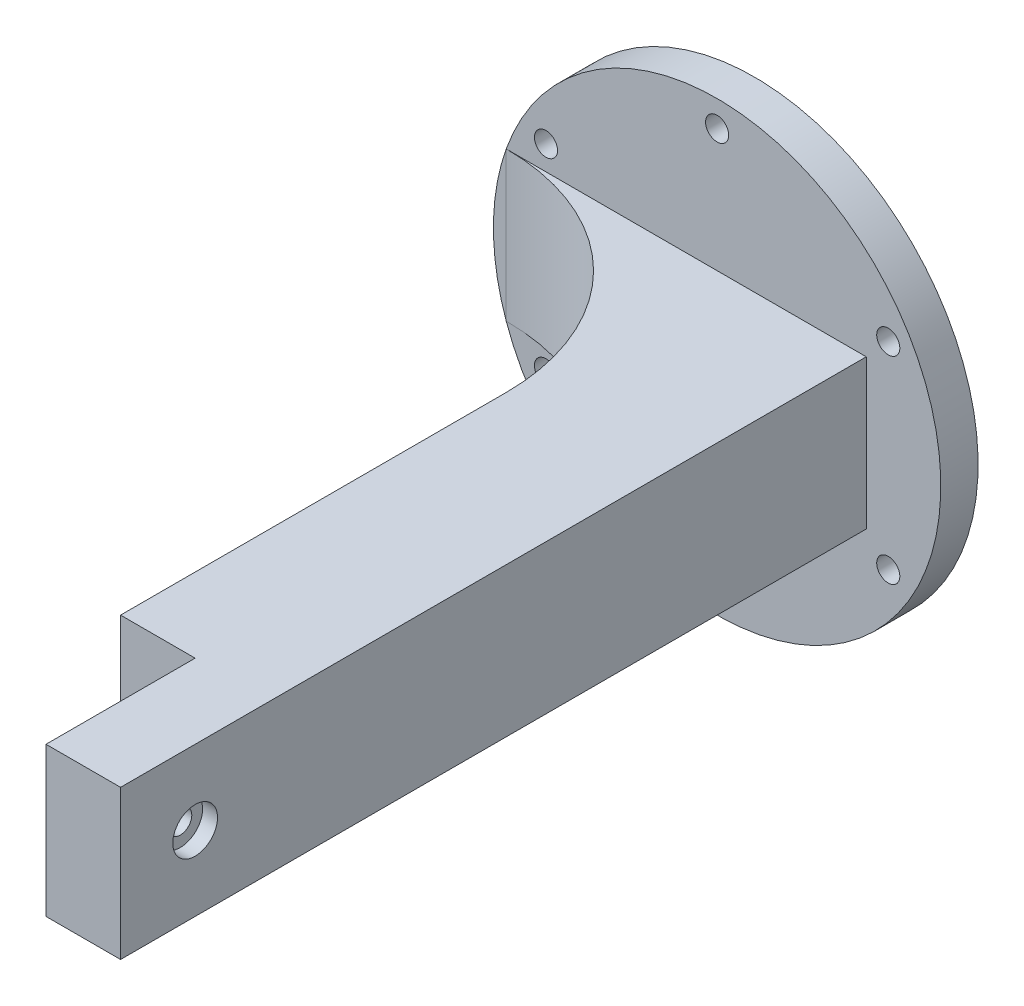
ISO-10303-21;
HEADER;
FILE_DESCRIPTION(('STEP AP214'),'2;1');
FILE_NAME('part.step','',(''),(''),'','','');
FILE_SCHEMA(('AUTOMOTIVE_DESIGN { 1 0 10303 214 1 1 1 1 }'));
ENDSEC;
DATA;
#1=APPLICATION_CONTEXT('core data for automotive mechanical design processes');
#2=APPLICATION_PROTOCOL_DEFINITION('international standard','automotive_design',2000,#1);
#3=PRODUCT_CONTEXT('',#1,'mechanical');
#4=PRODUCT('Part','Part','',(#3));
#5=PRODUCT_RELATED_PRODUCT_CATEGORY('part','',(#4));
#6=PRODUCT_DEFINITION_FORMATION('','',#4);
#7=PRODUCT_DEFINITION_CONTEXT('part definition',#1,'design');
#8=PRODUCT_DEFINITION('design','',#6,#7);
#9=PRODUCT_DEFINITION_SHAPE('','',#8);
#10=(LENGTH_UNIT() NAMED_UNIT(*) SI_UNIT(.MILLI.,.METRE.));
#11=(NAMED_UNIT(*) PLANE_ANGLE_UNIT() SI_UNIT($,.RADIAN.));
#12=(NAMED_UNIT(*) SI_UNIT($,.STERADIAN.) SOLID_ANGLE_UNIT());
#13=UNCERTAINTY_MEASURE_WITH_UNIT(LENGTH_MEASURE(1.E-05),#10,'distance_accuracy_value','');
#14=(GEOMETRIC_REPRESENTATION_CONTEXT(3) GLOBAL_UNCERTAINTY_ASSIGNED_CONTEXT((#13)) GLOBAL_UNIT_ASSIGNED_CONTEXT((#10,
#11,#12)) REPRESENTATION_CONTEXT('',''));
#15=CARTESIAN_POINT('',(0.,0.,0.));
#16=DIRECTION('',(0.,0.,1.));
#17=DIRECTION('',(1.,0.,0.));
#18=AXIS2_PLACEMENT_3D('',#15,#16,#17);
#19=CARTESIAN_POINT('',(-11.3775467694875,-10.8201831686628,-20.));
#20=DIRECTION('',(0.,0.,1.));
#21=DIRECTION('',(1.,0.,0.));
#22=AXIS2_PLACEMENT_3D('',#19,#20,#21);
#23=CYLINDRICAL_SURFACE('',#22,2.);
#24=CARTESIAN_POINT('',(-11.3775467694875,-10.8201831686628,80.));
#25=DIRECTION('',(0.,0.,1.));
#26=DIRECTION('',(1.,0.,0.));
#27=AXIS2_PLACEMENT_3D('',#24,#25,#26);
#28=CIRCLE('',#27,2.);
#29=CARTESIAN_POINT('',(-9.37754676948747,-10.8201831686628,80.));
#30=VERTEX_POINT('',#29);
#31=EDGE_CURVE('E390',#30,#30,#28,.T.);
#32=ORIENTED_EDGE('',*,*,#31,.T.);
#33=EDGE_LOOP('',(#32));
#34=FACE_BOUND('',#33,.T.);
#35=CARTESIAN_POINT('',(-11.3775467694875,-10.8201831686628,30.));
#36=DIRECTION('',(0.,0.,-1.));
#37=DIRECTION('',(-1.,0.,0.));
#38=AXIS2_PLACEMENT_3D('',#35,#36,#37);
#39=CIRCLE('',#38,2.);
#40=CARTESIAN_POINT('',(-10.0628026134659,-12.3273154801097,30.));
#41=VERTEX_POINT('',#40);
#42=CARTESIAN_POINT('',(-12.8846790809343,-9.50543901264125,30.));
#43=VERTEX_POINT('',#42);
#44=EDGE_CURVE('E296',#41,#43,#39,.T.);
#45=ORIENTED_EDGE('',*,*,#44,.T.);
#46=CARTESIAN_POINT('',(-11.3775467694875,-10.8201831686628,30.));
#47=DIRECTION('',(0.,0.,-1.));
#48=DIRECTION('',(-1.,0.,0.));
#49=AXIS2_PLACEMENT_3D('',#46,#47,#48);
#50=CIRCLE('',#49,2.);
#51=EDGE_CURVE('E12',#41,#43,#50,.F.);
#52=ORIENTED_EDGE('',*,*,#51,.F.);
#53=EDGE_LOOP('',(#45,#52));
#54=FACE_BOUND('',#53,.T.);
#55=ADVANCED_FACE('F156',(#34,#54),#23,.F.);
#56=CARTESIAN_POINT('',(0.,0.,-2.));
#57=DIRECTION('',(0.,0.,-1.));
#58=DIRECTION('',(-1.,0.,0.));
#59=AXIS2_PLACEMENT_3D('',#56,#57,#58);
#60=PLANE('',#59);
#61=DIRECTION('',(-1.,0.,0.));
#62=VECTOR('',#61,1.);
#63=CARTESIAN_POINT('',(-16.3775467694875,-4.82018316866282,-2.));
#64=LINE('',#63,#62);
#65=CARTESIAN_POINT('',(-16.3775467694875,-4.82018316866282,-2.));
#66=VERTEX_POINT('',#65);
#67=CARTESIAN_POINT('',(-46.310805863679,-4.82018316866282,-2.));
#68=VERTEX_POINT('',#67);
#69=EDGE_CURVE('E369',#66,#68,#64,.T.);
#70=ORIENTED_EDGE('',*,*,#69,.F.);
#71=DIRECTION('',(0.989696894724554,-0.14317840819263,0.));
#72=VECTOR('',#71,1.);
#73=CARTESIAN_POINT('',(-1.01877614010779,-7.04212035188726,-2.));
#74=LINE('',#73,#72);
#75=CARTESIAN_POINT('',(-9.60060106023687,-5.80059677229282,-2.));
#76=VERTEX_POINT('',#75);
#77=EDGE_CURVE('E172',#66,#76,#74,.T.);
#78=ORIENTED_EDGE('',*,*,#77,.T.);
#79=DIRECTION('',(-0.707106781186548,-0.707106781186547,0.));
#80=VECTOR('',#79,1.);
#81=CARTESIAN_POINT('',(-1.90000214397203,1.90000214397203,-2.));
#82=LINE('',#81,#80);
#83=CARTESIAN_POINT('',(-13.0950611907598,-9.29505690281575,-2.));
#84=VERTEX_POINT('',#83);
#85=EDGE_CURVE('E307',#76,#84,#82,.T.);
#86=ORIENTED_EDGE('',*,*,#85,.T.);
#87=DIRECTION('',(0.989696894724554,-0.143178408192631,0.));
#88=VECTOR('',#87,1.);
#89=CARTESIAN_POINT('',(-1.58558904402719,-10.9601201255969,-2.));
#90=LINE('',#89,#88);
#91=CARTESIAN_POINT('',(-16.3775467694875,-8.82018316866282,-2.));
#92=VERTEX_POINT('',#91);
#93=EDGE_CURVE('E311',#92,#84,#90,.T.);
#94=ORIENTED_EDGE('',*,*,#93,.F.);
#95=DIRECTION('',(1.,0.,0.));
#96=VECTOR('',#95,1.);
#97=CARTESIAN_POINT('',(-50.6830779439235,-8.82018316866282,-2.));
#98=LINE('',#97,#96);
#99=CARTESIAN_POINT('',(-46.310805863679,-8.82018316866282,-2.));
#100=VERTEX_POINT('',#99);
#101=EDGE_CURVE('E365',#100,#92,#98,.T.);
#102=ORIENTED_EDGE('',*,*,#101,.F.);
#103=CARTESIAN_POINT('',(-16.3775467694875,-6.82018316866282,-2.));
#104=DIRECTION('',(0.,0.,-1.));
#105=DIRECTION('',(-1.,0.,0.));
#106=AXIS2_PLACEMENT_3D('',#103,#104,#105);
#107=CIRCLE('',#106,30.);
#108=EDGE_CURVE('E387',#100,#68,#107,.T.);
#109=ORIENTED_EDGE('',*,*,#108,.T.);
#110=EDGE_LOOP('',(#70,#78,#86,#94,#102,#109));
#111=FACE_BOUND('',#110,.T.);
#112=ADVANCED_FACE('F551',(#111),#60,.T.);
#113=CARTESIAN_POINT('',(-16.3775467694875,-6.82018316866282,-5.));
#114=DIRECTION('',(0.,0.,-1.));
#115=DIRECTION('',(-1.,0.,0.));
#116=AXIS2_PLACEMENT_3D('',#113,#114,#115);
#117=PLANE('',#116);
#118=DIRECTION('',(0.989696894724554,-0.14317840819263,0.));
#119=VECTOR('',#118,1.);
#120=CARTESIAN_POINT('',(-1.01877614010779,-7.04212035188726,-5.));
#121=LINE('',#120,#119);
#122=CARTESIAN_POINT('',(-16.3775467694875,-4.82018316866282,-5.));
#123=VERTEX_POINT('',#122);
#124=CARTESIAN_POINT('',(-9.60060106023687,-5.80059677229282,-5.));
#125=VERTEX_POINT('',#124);
#126=EDGE_CURVE('E299',#123,#125,#121,.T.);
#127=ORIENTED_EDGE('',*,*,#126,.F.);
#128=DIRECTION('',(-1.,0.,0.));
#129=VECTOR('',#128,1.);
#130=CARTESIAN_POINT('',(-16.3775467694875,-4.82018316866282,-5.));
#131=LINE('',#130,#129);
#132=CARTESIAN_POINT('',(-46.310805863679,-4.82018316866282,-5.));
#133=VERTEX_POINT('',#132);
#134=EDGE_CURVE('E370',#123,#133,#131,.T.);
#135=ORIENTED_EDGE('',*,*,#134,.T.);
#136=CARTESIAN_POINT('',(-16.3775467694875,-6.82018316866282,-5.));
#137=DIRECTION('',(0.,0.,-1.));
#138=DIRECTION('',(-1.,0.,0.));
#139=AXIS2_PLACEMENT_3D('',#136,#137,#138);
#140=CIRCLE('',#139,30.);
#141=CARTESIAN_POINT('',(-46.310805863679,-8.82018316866282,-5.));
#142=VERTEX_POINT('',#141);
#143=EDGE_CURVE('E505',#133,#142,#140,.T.);
#144=ORIENTED_EDGE('',*,*,#143,.T.);
#145=DIRECTION('',(1.,0.,0.));
#146=VECTOR('',#145,1.);
#147=CARTESIAN_POINT('',(-50.6830779439235,-8.82018316866282,-5.));
#148=LINE('',#147,#146);
#149=CARTESIAN_POINT('',(-16.3775467694875,-8.82018316866282,-5.));
#150=VERTEX_POINT('',#149);
#151=EDGE_CURVE('E357',#142,#150,#148,.T.);
#152=ORIENTED_EDGE('',*,*,#151,.T.);
#153=DIRECTION('',(0.989696894724554,-0.143178408192631,0.));
#154=VECTOR('',#153,1.);
#155=CARTESIAN_POINT('',(-1.58558904402719,-10.9601201255969,-5.));
#156=LINE('',#155,#154);
#157=CARTESIAN_POINT('',(-13.0950611907598,-9.29505690281575,-5.));
#158=VERTEX_POINT('',#157);
#159=EDGE_CURVE('E308',#150,#158,#156,.T.);
#160=ORIENTED_EDGE('',*,*,#159,.T.);
#161=DIRECTION('',(-0.707106781186547,0.707106781186548,0.));
#162=VECTOR('',#161,1.);
#163=CARTESIAN_POINT('',(-11.1950590467878,-11.1950590467878,-5.));
#164=LINE('',#163,#162);
#165=CARTESIAN_POINT('',(-8.85242050364053,-13.537697589935,-5.));
#166=VERTEX_POINT('',#165);
#167=EDGE_CURVE('E347',#166,#158,#164,.T.);
#168=ORIENTED_EDGE('',*,*,#167,.F.);
#169=DIRECTION('',(0.707106781186547,0.707106781186548,0.));
#170=VECTOR('',#169,1.);
#171=CARTESIAN_POINT('',(2.34263854314726,-2.34263854314726,-5.));
#172=LINE('',#171,#170);
#173=CARTESIAN_POINT('',(0.339967651784592,-4.34530943450992,-5.));
#174=VERTEX_POINT('',#173);
#175=EDGE_CURVE('E343',#166,#174,#172,.T.);
#176=ORIENTED_EDGE('',*,*,#175,.T.);
#177=DIRECTION('',(-0.707106781186547,0.707106781186548,0.));
#178=VECTOR('',#177,1.);
#179=CARTESIAN_POINT('',(-2.00267089136266,-2.00267089136266,-5.));
#180=LINE('',#179,#178);
#181=CARTESIAN_POINT('',(-3.90267303533469,-0.102668747390637,-5.));
#182=VERTEX_POINT('',#181);
#183=EDGE_CURVE('E324',#174,#182,#180,.T.);
#184=ORIENTED_EDGE('',*,*,#183,.T.);
#185=DIRECTION('',(-0.707106781186548,-0.707106781186547,0.));
#186=VECTOR('',#185,1.);
#187=CARTESIAN_POINT('',(-1.90000214397203,1.90000214397203,-5.));
#188=LINE('',#187,#186);
#189=EDGE_CURVE('E332',#182,#125,#188,.T.);
#190=ORIENTED_EDGE('',*,*,#189,.T.);
#191=EDGE_LOOP('',(#127,#135,#144,#152,#160,#168,#176,#184,#190));
#192=FACE_BOUND('',#191,.T.);
#193=CARTESIAN_POINT('',(-39.3272199697752,6.42981683133702,-5.));
#194=DIRECTION('',(0.,0.,-1.));
#195=DIRECTION('',(-1.,0.,0.));
#196=AXIS2_PLACEMENT_3D('',#193,#194,#195);
#197=CIRCLE('',#196,1.55);
#198=CARTESIAN_POINT('',(-40.8772199697752,6.42981683133702,-5.));
#199=VERTEX_POINT('',#198);
#200=EDGE_CURVE('E465',#199,#199,#197,.T.);
#201=ORIENTED_EDGE('',*,*,#200,.F.);
#202=EDGE_LOOP('',(#201));
#203=FACE_BOUND('',#202,.T.);
#204=CARTESIAN_POINT('',(-16.3775467694877,-33.3201831686628,-5.));
#205=DIRECTION('',(0.,0.,-1.));
#206=DIRECTION('',(-1.,0.,0.));
#207=AXIS2_PLACEMENT_3D('',#204,#205,#206);
#208=CIRCLE('',#207,1.55);
#209=CARTESIAN_POINT('',(-17.9275467694876,-33.3201831686628,-5.));
#210=VERTEX_POINT('',#209);
#211=EDGE_CURVE('E481',#210,#210,#208,.T.);
#212=ORIENTED_EDGE('',*,*,#211,.F.);
#213=EDGE_LOOP('',(#212));
#214=FACE_BOUND('',#213,.T.);
#215=CARTESIAN_POINT('',(6.57212643080018,6.42981683133712,-5.));
#216=DIRECTION('',(0.,0.,-1.));
#217=DIRECTION('',(-1.,0.,0.));
#218=AXIS2_PLACEMENT_3D('',#215,#216,#217);
#219=CIRCLE('',#218,1.55);
#220=CARTESIAN_POINT('',(5.02212643080018,6.42981683133712,-5.));
#221=VERTEX_POINT('',#220);
#222=EDGE_CURVE('E497',#221,#221,#219,.T.);
#223=ORIENTED_EDGE('',*,*,#222,.F.);
#224=EDGE_LOOP('',(#223));
#225=FACE_BOUND('',#224,.T.);
#226=CARTESIAN_POINT('',(6.57212643080009,-20.0701831686629,-5.));
#227=DIRECTION('',(0.,0.,-1.));
#228=DIRECTION('',(-1.,0.,0.));
#229=AXIS2_PLACEMENT_3D('',#226,#227,#228);
#230=CIRCLE('',#229,1.55);
#231=CARTESIAN_POINT('',(5.02212643080009,-20.0701831686629,-5.));
#232=VERTEX_POINT('',#231);
#233=EDGE_CURVE('E489',#232,#232,#230,.T.);
#234=ORIENTED_EDGE('',*,*,#233,.F.);
#235=EDGE_LOOP('',(#234));
#236=FACE_BOUND('',#235,.T.);
#237=CARTESIAN_POINT('',(-39.3272199697753,-20.0701831686627,-5.));
#238=DIRECTION('',(0.,0.,-1.));
#239=DIRECTION('',(-1.,0.,0.));
#240=AXIS2_PLACEMENT_3D('',#237,#238,#239);
#241=CIRCLE('',#240,1.55);
#242=CARTESIAN_POINT('',(-40.8772199697753,-20.0701831686627,-5.));
#243=VERTEX_POINT('',#242);
#244=EDGE_CURVE('E473',#243,#243,#241,.T.);
#245=ORIENTED_EDGE('',*,*,#244,.F.);
#246=EDGE_LOOP('',(#245));
#247=FACE_BOUND('',#246,.T.);
#248=CARTESIAN_POINT('',(-16.3775467694875,19.6798168313372,-5.));
#249=DIRECTION('',(0.,0.,-1.));
#250=DIRECTION('',(-1.,0.,0.));
#251=AXIS2_PLACEMENT_3D('',#248,#249,#250);
#252=CIRCLE('',#251,1.55);
#253=CARTESIAN_POINT('',(-17.9275467694875,19.6798168313372,-5.));
#254=VERTEX_POINT('',#253);
#255=EDGE_CURVE('E457',#254,#254,#252,.T.);
#256=ORIENTED_EDGE('',*,*,#255,.F.);
#257=EDGE_LOOP('',(#256));
#258=FACE_BOUND('',#257,.T.);
#259=ADVANCED_FACE('F560',(#192,#203,#214,#225,#236,#247,#258),#117,.T.);
#260=CARTESIAN_POINT('',(-16.3775467694875,-6.82018316866282,-5.));
#261=DIRECTION('',(0.,0.,1.));
#262=DIRECTION('',(1.,0.,0.));
#263=AXIS2_PLACEMENT_3D('',#260,#261,#262);
#264=CYLINDRICAL_SURFACE('',#263,30.);
#265=CARTESIAN_POINT('',(-16.3775467694875,-6.82018316866282,0.));
#266=DIRECTION('',(0.,0.,-1.));
#267=DIRECTION('',(-1.,0.,0.));
#268=AXIS2_PLACEMENT_3D('',#265,#266,#267);
#269=CIRCLE('',#268,30.);
#270=CARTESIAN_POINT('',(-44.6618180169494,3.17981683133718,2.53810514272423E-09));
#271=VERTEX_POINT('',#270);
#272=CARTESIAN_POINT('',(-44.6618180169494,-16.8201831686628,2.53810514272423E-09));
#273=VERTEX_POINT('',#272);
#274=EDGE_CURVE('E510',#271,#273,#269,.T.);
#275=ORIENTED_EDGE('',*,*,#274,.T.);
#276=EDGE_CURVE('E501',#273,#271,#269,.T.);
#277=ORIENTED_EDGE('',*,*,#276,.T.);
#278=EDGE_LOOP('',(#275,#277));
#279=FACE_BOUND('',#278,.T.);
#280=DIRECTION('',(0.,0.,1.));
#281=VECTOR('',#280,1.);
#282=CARTESIAN_POINT('',(-46.310805863679,-8.82018316866282,-5.));
#283=LINE('',#282,#281);
#284=EDGE_CURVE('E165',#142,#100,#283,.T.);
#285=ORIENTED_EDGE('',*,*,#284,.F.);
#286=ORIENTED_EDGE('',*,*,#143,.F.);
#287=DIRECTION('',(0.,0.,1.));
#288=VECTOR('',#287,1.);
#289=CARTESIAN_POINT('',(-46.310805863679,-4.82018316866282,-5.));
#290=LINE('',#289,#288);
#291=EDGE_CURVE('E537',#68,#133,#290,.F.);
#292=ORIENTED_EDGE('',*,*,#291,.F.);
#293=ORIENTED_EDGE('',*,*,#108,.F.);
#294=EDGE_LOOP('',(#285,#286,#292,#293));
#295=FACE_BOUND('',#294,.T.);
#296=ADVANCED_FACE('F553',(#279,#295),#264,.T.);
#297=CARTESIAN_POINT('',(21.9067244805125,-6.82018316866258,90.));
#298=DIRECTION('',(-1.,0.,0.));
#299=DIRECTION('',(0.,0.,1.));
#300=AXIS2_PLACEMENT_3D('',#297,#298,#299);
#301=CYLINDRICAL_SURFACE('',#300,1.54999999999999);
#302=CARTESIAN_POINT('',(-6.37754676948747,-6.82018316866258,90.));
#303=DIRECTION('',(-1.,0.,0.));
#304=DIRECTION('',(0.,0.,1.));
#305=AXIS2_PLACEMENT_3D('',#302,#303,#304);
#306=CIRCLE('',#305,1.54999999999999);
#307=CARTESIAN_POINT('',(-6.37754676948747,-6.82018316866258,91.55));
#308=VERTEX_POINT('',#307);
#309=EDGE_CURVE('E403',#308,#308,#306,.T.);
#310=ORIENTED_EDGE('',*,*,#309,.T.);
#311=EDGE_LOOP('',(#310));
#312=FACE_BOUND('',#311,.T.);
#313=CARTESIAN_POINT('',(1.62245323051253,-6.82018316866258,90.));
#314=DIRECTION('',(1.,0.,0.));
#315=DIRECTION('',(0.,1.,0.));
#316=AXIS2_PLACEMENT_3D('',#313,#314,#315);
#317=CIRCLE('',#316,1.54999999999999);
#318=CARTESIAN_POINT('',(1.62245323051253,-5.27018316866258,90.));
#319=VERTEX_POINT('',#318);
#320=EDGE_CURVE('E399',#319,#319,#317,.F.);
#321=ORIENTED_EDGE('',*,*,#320,.F.);
#322=EDGE_LOOP('',(#321));
#323=FACE_BOUND('',#322,.T.);
#324=ADVANCED_FACE('F606',(#312,#323),#301,.F.);
#325=CARTESIAN_POINT('',(-16.3775467694875,-16.8201831686628,140.));
#326=DIRECTION('',(0.,1.,0.));
#327=DIRECTION('',(0.,0.,1.));
#328=AXIS2_PLACEMENT_3D('',#325,#326,#327);
#329=PLANE('',#328);
#330=DIRECTION('',(1.,0.,0.));
#331=VECTOR('',#330,1.);
#332=CARTESIAN_POINT('',(-16.3775467694875,-16.8201831686628,100.));
#333=LINE('',#332,#331);
#334=CARTESIAN_POINT('',(-6.37754676948747,-16.8201831686628,100.));
#335=VERTEX_POINT('',#334);
#336=CARTESIAN_POINT('',(3.62245323051253,-16.8201831686628,100.));
#337=VERTEX_POINT('',#336);
#338=EDGE_CURVE('E435',#335,#337,#333,.T.);
#339=ORIENTED_EDGE('',*,*,#338,.F.);
#340=DIRECTION('',(0.,0.,-1.));
#341=VECTOR('',#340,1.);
#342=CARTESIAN_POINT('',(-6.37754676948748,-16.8201831686628,140.));
#343=LINE('',#342,#341);
#344=CARTESIAN_POINT('',(-6.37754676948747,-16.8201831686628,80.));
#345=VERTEX_POINT('',#344);
#346=EDGE_CURVE('E438',#335,#345,#343,.T.);
#347=ORIENTED_EDGE('',*,*,#346,.T.);
#348=DIRECTION('',(-1.,0.,0.));
#349=VECTOR('',#348,1.);
#350=CARTESIAN_POINT('',(-16.3775467694876,-16.8201831686628,80.));
#351=LINE('',#350,#349);
#352=CARTESIAN_POINT('',(-16.3775467694875,-16.8201831686628,80.));
#353=VERTEX_POINT('',#352);
#354=EDGE_CURVE('E422',#345,#353,#351,.T.);
#355=ORIENTED_EDGE('',*,*,#354,.T.);
#356=DIRECTION('',(0.,0.,-1.));
#357=VECTOR('',#356,1.);
#358=CARTESIAN_POINT('',(-16.3775467694875,-16.8201831686628,140.));
#359=LINE('',#358,#357);
#360=CARTESIAN_POINT('',(-16.3775467694875,-16.8201831686628,28.28427125));
#361=VERTEX_POINT('',#360);
#362=EDGE_CURVE('E525',#353,#361,#359,.T.);
#363=ORIENTED_EDGE('',*,*,#362,.T.);
#364=CARTESIAN_POINT('',(-44.6618180169494,-16.8201831686628,28.28427125));
#365=DIRECTION('',(0.,1.,0.));
#366=DIRECTION('',(0.,0.,1.));
#367=AXIS2_PLACEMENT_3D('',#364,#365,#366);
#368=CIRCLE('',#367,28.2842712474619);
#369=EDGE_CURVE('E445',#361,#273,#368,.T.);
#370=ORIENTED_EDGE('',*,*,#369,.T.);
#371=DIRECTION('',(1.,0.,0.));
#372=VECTOR('',#371,1.);
#373=CARTESIAN_POINT('',(-16.3775467694875,-16.8201831686628,0.));
#374=LINE('',#373,#372);
#375=CARTESIAN_POINT('',(3.62245323051253,-16.8201831686628,0.));
#376=VERTEX_POINT('',#375);
#377=EDGE_CURVE('E509',#273,#376,#374,.T.);
#378=ORIENTED_EDGE('',*,*,#377,.T.);
#379=DIRECTION('',(0.,0.,-1.));
#380=VECTOR('',#379,1.);
#381=CARTESIAN_POINT('',(3.62245323051253,-16.8201831686628,140.));
#382=LINE('',#381,#380);
#383=EDGE_CURVE('E534',#337,#376,#382,.T.);
#384=ORIENTED_EDGE('',*,*,#383,.F.);
#385=EDGE_LOOP('',(#339,#347,#355,#363,#370,#378,#384));
#386=FACE_BOUND('',#385,.T.);
#387=ADVANCED_FACE('F158',(#386),#329,.F.);
#388=CARTESIAN_POINT('',(3.62245323051253,3.17981683133718,140.));
#389=DIRECTION('',(1.,0.,0.));
#390=DIRECTION('',(0.,1.,0.));
#391=AXIS2_PLACEMENT_3D('',#388,#389,#390);
#392=PLANE('',#391);
#393=CARTESIAN_POINT('',(3.62245323051253,-6.82018316866258,90.));
#394=DIRECTION('',(1.,0.,0.));
#395=DIRECTION('',(0.,1.,0.));
#396=AXIS2_PLACEMENT_3D('',#393,#394,#395);
#397=CIRCLE('',#396,3.00000000000001);
#398=CARTESIAN_POINT('',(3.62245323051253,-3.82018316866257,90.));
#399=VERTEX_POINT('',#398);
#400=EDGE_CURVE('E394',#399,#399,#397,.T.);
#401=ORIENTED_EDGE('',*,*,#400,.F.);
#402=EDGE_LOOP('',(#401));
#403=FACE_BOUND('',#402,.T.);
#404=DIRECTION('',(0.,0.,-1.));
#405=VECTOR('',#404,1.);
#406=CARTESIAN_POINT('',(3.62245323051253,3.17981683133718,140.));
#407=LINE('',#406,#405);
#408=CARTESIAN_POINT('',(3.62245323051253,3.17981683133718,100.));
#409=VERTEX_POINT('',#408);
#410=CARTESIAN_POINT('',(3.62245323051253,3.17981683133718,0.));
#411=VERTEX_POINT('',#410);
#412=EDGE_CURVE('E531',#409,#411,#407,.T.);
#413=ORIENTED_EDGE('',*,*,#412,.F.);
#414=DIRECTION('',(0.,1.,0.));
#415=VECTOR('',#414,1.);
#416=CARTESIAN_POINT('',(3.62245323051253,-25.1044544186628,100.));
#417=LINE('',#416,#415);
#418=EDGE_CURVE('E423',#337,#409,#417,.T.);
#419=ORIENTED_EDGE('',*,*,#418,.F.);
#420=ORIENTED_EDGE('',*,*,#383,.T.);
#421=DIRECTION('',(0.,-1.,0.));
#422=VECTOR('',#421,1.);
#423=CARTESIAN_POINT('',(3.62245323051253,3.17981683133718,0.));
#424=LINE('',#423,#422);
#425=EDGE_CURVE('E517',#411,#376,#424,.T.);
#426=ORIENTED_EDGE('',*,*,#425,.F.);
#427=EDGE_LOOP('',(#413,#419,#420,#426));
#428=FACE_BOUND('',#427,.T.);
#429=ADVANCED_FACE('F665',(#403,#428),#392,.T.);
#430=CARTESIAN_POINT('',(-16.3775467694875,3.17981683133718,140.));
#431=DIRECTION('',(0.,1.,0.));
#432=DIRECTION('',(0.,0.,1.));
#433=AXIS2_PLACEMENT_3D('',#430,#431,#432);
#434=PLANE('',#433);
#435=DIRECTION('',(0.,0.,-1.));
#436=VECTOR('',#435,1.);
#437=CARTESIAN_POINT('',(-6.37754676948747,3.17981683133718,100.));
#438=LINE('',#437,#436);
#439=CARTESIAN_POINT('',(-6.37754676948747,3.17981683133718,100.));
#440=VERTEX_POINT('',#439);
#441=CARTESIAN_POINT('',(-6.37754676948747,3.17981683133718,80.));
#442=VERTEX_POINT('',#441);
#443=EDGE_CURVE('E407',#440,#442,#438,.T.);
#444=ORIENTED_EDGE('',*,*,#443,.F.);
#445=DIRECTION('',(1.,0.,0.));
#446=VECTOR('',#445,1.);
#447=CARTESIAN_POINT('',(-6.37754676948747,3.17981683133718,100.));
#448=LINE('',#447,#446);
#449=EDGE_CURVE('E414',#440,#409,#448,.T.);
#450=ORIENTED_EDGE('',*,*,#449,.T.);
#451=ORIENTED_EDGE('',*,*,#412,.T.);
#452=DIRECTION('',(1.,0.,0.));
#453=VECTOR('',#452,1.);
#454=CARTESIAN_POINT('',(-16.3775467694875,3.17981683133718,0.));
#455=LINE('',#454,#453);
#456=EDGE_CURVE('E521',#271,#411,#455,.T.);
#457=ORIENTED_EDGE('',*,*,#456,.F.);
#458=CARTESIAN_POINT('',(-44.6618180169494,3.17981683133718,28.28427125));
#459=DIRECTION('',(0.,1.,0.));
#460=DIRECTION('',(0.,0.,1.));
#461=AXIS2_PLACEMENT_3D('',#458,#459,#460);
#462=CIRCLE('',#461,28.2842712474619);
#463=CARTESIAN_POINT('',(-16.3775467694875,3.17981683133718,28.28427125));
#464=VERTEX_POINT('',#463);
#465=EDGE_CURVE('E442',#464,#271,#462,.T.);
#466=ORIENTED_EDGE('',*,*,#465,.F.);
#467=DIRECTION('',(0.,0.,-1.));
#468=VECTOR('',#467,1.);
#469=CARTESIAN_POINT('',(-16.3775467694875,3.17981683133718,140.));
#470=LINE('',#469,#468);
#471=CARTESIAN_POINT('',(-16.3775467694875,3.17981683133718,80.));
#472=VERTEX_POINT('',#471);
#473=EDGE_CURVE('E528',#472,#464,#470,.T.);
#474=ORIENTED_EDGE('',*,*,#473,.F.);
#475=DIRECTION('',(-1.,0.,0.));
#476=VECTOR('',#475,1.);
#477=CARTESIAN_POINT('',(-6.37754676948747,3.17981683133718,80.));
#478=LINE('',#477,#476);
#479=EDGE_CURVE('E411',#442,#472,#478,.T.);
#480=ORIENTED_EDGE('',*,*,#479,.F.);
#481=EDGE_LOOP('',(#444,#450,#451,#457,#466,#474,#480));
#482=FACE_BOUND('',#481,.T.);
#483=ADVANCED_FACE('F656',(#482),#434,.T.);
#484=CARTESIAN_POINT('',(-16.3775467694875,-6.82018316866282,0.));
#485=DIRECTION('',(0.,0.,-1.));
#486=DIRECTION('',(-1.,0.,0.));
#487=AXIS2_PLACEMENT_3D('',#484,#485,#486);
#488=PLANE('',#487);
#489=CARTESIAN_POINT('',(-16.3775467694875,19.6798168313372,0.));
#490=DIRECTION('',(0.,0.,-1.));
#491=DIRECTION('',(-1.,0.,0.));
#492=AXIS2_PLACEMENT_3D('',#489,#490,#491);
#493=CIRCLE('',#492,1.55);
#494=CARTESIAN_POINT('',(-17.9275467694875,19.6798168313372,0.));
#495=VERTEX_POINT('',#494);
#496=EDGE_CURVE('E454',#495,#495,#493,.T.);
#497=ORIENTED_EDGE('',*,*,#496,.T.);
#498=EDGE_LOOP('',(#497));
#499=FACE_BOUND('',#498,.T.);
#500=CARTESIAN_POINT('',(-39.3272199697752,6.42981683133702,0.));
#501=DIRECTION('',(0.,0.,-1.));
#502=DIRECTION('',(-1.,0.,0.));
#503=AXIS2_PLACEMENT_3D('',#500,#501,#502);
#504=CIRCLE('',#503,1.55);
#505=CARTESIAN_POINT('',(-40.8772199697752,6.42981683133702,0.));
#506=VERTEX_POINT('',#505);
#507=EDGE_CURVE('E461',#506,#506,#504,.T.);
#508=ORIENTED_EDGE('',*,*,#507,.T.);
#509=EDGE_LOOP('',(#508));
#510=FACE_BOUND('',#509,.T.);
#511=CARTESIAN_POINT('',(-39.3272199697753,-20.0701831686627,0.));
#512=DIRECTION('',(0.,0.,-1.));
#513=DIRECTION('',(-1.,0.,0.));
#514=AXIS2_PLACEMENT_3D('',#511,#512,#513);
#515=CIRCLE('',#514,1.55);
#516=CARTESIAN_POINT('',(-40.8772199697753,-20.0701831686627,0.));
#517=VERTEX_POINT('',#516);
#518=EDGE_CURVE('E469',#517,#517,#515,.T.);
#519=ORIENTED_EDGE('',*,*,#518,.T.);
#520=EDGE_LOOP('',(#519));
#521=FACE_BOUND('',#520,.T.);
#522=CARTESIAN_POINT('',(-16.3775467694877,-33.3201831686628,0.));
#523=DIRECTION('',(0.,0.,-1.));
#524=DIRECTION('',(-1.,0.,0.));
#525=AXIS2_PLACEMENT_3D('',#522,#523,#524);
#526=CIRCLE('',#525,1.55);
#527=CARTESIAN_POINT('',(-17.9275467694876,-33.3201831686628,0.));
#528=VERTEX_POINT('',#527);
#529=EDGE_CURVE('E477',#528,#528,#526,.T.);
#530=ORIENTED_EDGE('',*,*,#529,.T.);
#531=EDGE_LOOP('',(#530));
#532=FACE_BOUND('',#531,.T.);
#533=CARTESIAN_POINT('',(6.57212643080009,-20.0701831686629,0.));
#534=DIRECTION('',(0.,0.,-1.));
#535=DIRECTION('',(-1.,0.,0.));
#536=AXIS2_PLACEMENT_3D('',#533,#534,#535);
#537=CIRCLE('',#536,1.55);
#538=CARTESIAN_POINT('',(5.02212643080009,-20.0701831686629,0.));
#539=VERTEX_POINT('',#538);
#540=EDGE_CURVE('E485',#539,#539,#537,.T.);
#541=ORIENTED_EDGE('',*,*,#540,.T.);
#542=EDGE_LOOP('',(#541));
#543=FACE_BOUND('',#542,.T.);
#544=CARTESIAN_POINT('',(6.57212643080018,6.42981683133712,0.));
#545=DIRECTION('',(0.,0.,-1.));
#546=DIRECTION('',(-1.,0.,0.));
#547=AXIS2_PLACEMENT_3D('',#544,#545,#546);
#548=CIRCLE('',#547,1.55);
#549=CARTESIAN_POINT('',(5.02212643080018,6.42981683133712,0.));
#550=VERTEX_POINT('',#549);
#551=EDGE_CURVE('E493',#550,#550,#548,.T.);
#552=ORIENTED_EDGE('',*,*,#551,.T.);
#553=EDGE_LOOP('',(#552));
#554=FACE_BOUND('',#553,.T.);
#555=ORIENTED_EDGE('',*,*,#274,.F.);
#556=ORIENTED_EDGE('',*,*,#456,.T.);
#557=ORIENTED_EDGE('',*,*,#425,.T.);
#558=ORIENTED_EDGE('',*,*,#377,.F.);
#559=EDGE_LOOP('',(#555,#556,#557,#558));
#560=FACE_BOUND('',#559,.T.);
#561=ADVANCED_FACE('F652',(#499,#510,#521,#532,#543,#554,#560),#488,.F.);
#562=DIRECTION('',(0.,-1.,0.));
#563=VECTOR('',#562,1.);
#564=CARTESIAN_POINT('',(-44.6618180169494,3.17981683133718,0.));
#565=LINE('',#564,#563);
#566=EDGE_CURVE('E449',#271,#273,#565,.T.);
#567=ORIENTED_EDGE('',*,*,#566,.F.);
#568=ORIENTED_EDGE('',*,*,#276,.F.);
#569=EDGE_LOOP('',(#567,#568));
#570=FACE_BOUND('',#569,.T.);
#571=ADVANCED_FACE('F655',(#570),#488,.F.);
#572=CARTESIAN_POINT('',(-16.3775467694875,3.17981683133718,140.));
#573=DIRECTION('',(1.,0.,0.));
#574=DIRECTION('',(0.,1.,0.));
#575=AXIS2_PLACEMENT_3D('',#572,#573,#574);
#576=PLANE('',#575);
#577=ORIENTED_EDGE('',*,*,#362,.F.);
#578=DIRECTION('',(0.,1.,0.));
#579=VECTOR('',#578,1.);
#580=CARTESIAN_POINT('',(-16.3775467694875,-25.1044544186628,80.));
#581=LINE('',#580,#579);
#582=EDGE_CURVE('E426',#353,#472,#581,.T.);
#583=ORIENTED_EDGE('',*,*,#582,.T.);
#584=ORIENTED_EDGE('',*,*,#473,.T.);
#585=DIRECTION('',(0.,-1.,0.));
#586=VECTOR('',#585,1.);
#587=CARTESIAN_POINT('',(-16.3775467694875,3.17981683133718,28.28427125));
#588=LINE('',#587,#586);
#589=EDGE_CURVE('E450',#464,#361,#588,.T.);
#590=ORIENTED_EDGE('',*,*,#589,.T.);
#591=EDGE_LOOP('',(#577,#583,#584,#590));
#592=FACE_BOUND('',#591,.T.);
#593=ADVANCED_FACE('F648',(#592),#576,.F.);
#594=CARTESIAN_POINT('',(6.57212643080018,6.42981683133712,-5.));
#595=DIRECTION('',(0.,0.,1.));
#596=DIRECTION('',(1.,0.,0.));
#597=AXIS2_PLACEMENT_3D('',#594,#595,#596);
#598=CYLINDRICAL_SURFACE('',#597,1.55);
#599=ORIENTED_EDGE('',*,*,#222,.T.);
#600=EDGE_LOOP('',(#599));
#601=FACE_BOUND('',#600,.T.);
#602=ORIENTED_EDGE('',*,*,#551,.F.);
#603=EDGE_LOOP('',(#602));
#604=FACE_BOUND('',#603,.T.);
#605=ADVANCED_FACE('F644',(#601,#604),#598,.F.);
#606=CARTESIAN_POINT('',(6.57212643080009,-20.0701831686629,-5.));
#607=DIRECTION('',(0.,0.,1.));
#608=DIRECTION('',(1.,0.,0.));
#609=AXIS2_PLACEMENT_3D('',#606,#607,#608);
#610=CYLINDRICAL_SURFACE('',#609,1.55);
#611=ORIENTED_EDGE('',*,*,#233,.T.);
#612=EDGE_LOOP('',(#611));
#613=FACE_BOUND('',#612,.T.);
#614=ORIENTED_EDGE('',*,*,#540,.F.);
#615=EDGE_LOOP('',(#614));
#616=FACE_BOUND('',#615,.T.);
#617=ADVANCED_FACE('F640',(#613,#616),#610,.F.);
#618=CARTESIAN_POINT('',(-16.3775467694877,-33.3201831686628,-5.));
#619=DIRECTION('',(0.,0.,1.));
#620=DIRECTION('',(1.,0.,0.));
#621=AXIS2_PLACEMENT_3D('',#618,#619,#620);
#622=CYLINDRICAL_SURFACE('',#621,1.55);
#623=ORIENTED_EDGE('',*,*,#211,.T.);
#624=EDGE_LOOP('',(#623));
#625=FACE_BOUND('',#624,.T.);
#626=ORIENTED_EDGE('',*,*,#529,.F.);
#627=EDGE_LOOP('',(#626));
#628=FACE_BOUND('',#627,.T.);
#629=ADVANCED_FACE('F636',(#625,#628),#622,.F.);
#630=CARTESIAN_POINT('',(-39.3272199697753,-20.0701831686627,-5.));
#631=DIRECTION('',(0.,0.,1.));
#632=DIRECTION('',(1.,0.,0.));
#633=AXIS2_PLACEMENT_3D('',#630,#631,#632);
#634=CYLINDRICAL_SURFACE('',#633,1.55);
#635=ORIENTED_EDGE('',*,*,#244,.T.);
#636=EDGE_LOOP('',(#635));
#637=FACE_BOUND('',#636,.T.);
#638=ORIENTED_EDGE('',*,*,#518,.F.);
#639=EDGE_LOOP('',(#638));
#640=FACE_BOUND('',#639,.T.);
#641=ADVANCED_FACE('F632',(#637,#640),#634,.F.);
#642=CARTESIAN_POINT('',(-39.3272199697752,6.42981683133702,-5.));
#643=DIRECTION('',(0.,0.,1.));
#644=DIRECTION('',(1.,0.,0.));
#645=AXIS2_PLACEMENT_3D('',#642,#643,#644);
#646=CYLINDRICAL_SURFACE('',#645,1.55);
#647=ORIENTED_EDGE('',*,*,#200,.T.);
#648=EDGE_LOOP('',(#647));
#649=FACE_BOUND('',#648,.T.);
#650=ORIENTED_EDGE('',*,*,#507,.F.);
#651=EDGE_LOOP('',(#650));
#652=FACE_BOUND('',#651,.T.);
#653=ADVANCED_FACE('F628',(#649,#652),#646,.F.);
#654=CARTESIAN_POINT('',(-16.3775467694875,19.6798168313372,-5.));
#655=DIRECTION('',(0.,0.,1.));
#656=DIRECTION('',(1.,0.,0.));
#657=AXIS2_PLACEMENT_3D('',#654,#655,#656);
#658=CYLINDRICAL_SURFACE('',#657,1.55);
#659=ORIENTED_EDGE('',*,*,#255,.T.);
#660=EDGE_LOOP('',(#659));
#661=FACE_BOUND('',#660,.T.);
#662=ORIENTED_EDGE('',*,*,#496,.F.);
#663=EDGE_LOOP('',(#662));
#664=FACE_BOUND('',#663,.T.);
#665=ADVANCED_FACE('F624',(#661,#664),#658,.F.);
#666=CARTESIAN_POINT('',(-44.6618180169494,-25.1044544186628,28.28427125));
#667=DIRECTION('',(0.,1.,0.));
#668=DIRECTION('',(0.,0.,1.));
#669=AXIS2_PLACEMENT_3D('',#666,#667,#668);
#670=CYLINDRICAL_SURFACE('',#669,28.2842712474619);
#671=ORIENTED_EDGE('',*,*,#589,.F.);
#672=ORIENTED_EDGE('',*,*,#465,.T.);
#673=ORIENTED_EDGE('',*,*,#566,.T.);
#674=ORIENTED_EDGE('',*,*,#369,.F.);
#675=EDGE_LOOP('',(#671,#672,#673,#674));
#676=FACE_BOUND('',#675,.T.);
#677=ADVANCED_FACE('F620',(#676),#670,.F.);
#678=CARTESIAN_POINT('',(-6.37754676948747,-25.1044544186628,100.));
#679=DIRECTION('',(1.,0.,0.));
#680=DIRECTION('',(0.,0.,-1.));
#681=AXIS2_PLACEMENT_3D('',#678,#679,#680);
#682=PLANE('',#681);
#683=ORIENTED_EDGE('',*,*,#309,.F.);
#684=EDGE_LOOP('',(#683));
#685=FACE_BOUND('',#684,.T.);
#686=DIRECTION('',(0.,1.,0.));
#687=VECTOR('',#686,1.);
#688=CARTESIAN_POINT('',(-6.37754676948747,-25.1044544186628,100.));
#689=LINE('',#688,#687);
#690=EDGE_CURVE('E419',#335,#440,#689,.T.);
#691=ORIENTED_EDGE('',*,*,#690,.T.);
#692=ORIENTED_EDGE('',*,*,#443,.T.);
#693=DIRECTION('',(0.,1.,0.));
#694=VECTOR('',#693,1.);
#695=CARTESIAN_POINT('',(-6.37754676948747,-25.1044544186628,80.));
#696=LINE('',#695,#694);
#697=EDGE_CURVE('E418',#345,#442,#696,.T.);
#698=ORIENTED_EDGE('',*,*,#697,.F.);
#699=ORIENTED_EDGE('',*,*,#346,.F.);
#700=EDGE_LOOP('',(#691,#692,#698,#699));
#701=FACE_BOUND('',#700,.T.);
#702=ADVANCED_FACE('F613',(#685,#701),#682,.F.);
#703=CARTESIAN_POINT('',(-6.37754676948747,-25.1044544186628,100.));
#704=DIRECTION('',(0.,0.,1.));
#705=DIRECTION('',(1.,0.,0.));
#706=AXIS2_PLACEMENT_3D('',#703,#704,#705);
#707=PLANE('',#706);
#708=ORIENTED_EDGE('',*,*,#338,.T.);
#709=ORIENTED_EDGE('',*,*,#418,.T.);
#710=ORIENTED_EDGE('',*,*,#449,.F.);
#711=ORIENTED_EDGE('',*,*,#690,.F.);
#712=EDGE_LOOP('',(#708,#709,#710,#711));
#713=FACE_BOUND('',#712,.T.);
#714=ADVANCED_FACE('F610',(#713),#707,.T.);
#715=CARTESIAN_POINT('',(-6.37754676948747,-25.1044544186628,80.));
#716=DIRECTION('',(0.,0.,-1.));
#717=DIRECTION('',(-1.,0.,0.));
#718=AXIS2_PLACEMENT_3D('',#715,#716,#717);
#719=PLANE('',#718);
#720=ORIENTED_EDGE('',*,*,#31,.F.);
#721=EDGE_LOOP('',(#720));
#722=FACE_BOUND('',#721,.T.);
#723=ORIENTED_EDGE('',*,*,#697,.T.);
#724=ORIENTED_EDGE('',*,*,#479,.T.);
#725=ORIENTED_EDGE('',*,*,#582,.F.);
#726=ORIENTED_EDGE('',*,*,#354,.F.);
#727=EDGE_LOOP('',(#723,#724,#725,#726));
#728=FACE_BOUND('',#727,.T.);
#729=ADVANCED_FACE('F601',(#722,#728),#719,.F.);
#730=CARTESIAN_POINT('',(1.62245323051253,-6.82018316866258,90.));
#731=DIRECTION('',(1.,0.,0.));
#732=DIRECTION('',(0.,1.,0.));
#733=AXIS2_PLACEMENT_3D('',#730,#731,#732);
#734=PLANE('',#733);
#735=CARTESIAN_POINT('',(1.62245323051253,-6.82018316866258,90.));
#736=DIRECTION('',(1.,0.,0.));
#737=DIRECTION('',(0.,1.,0.));
#738=AXIS2_PLACEMENT_3D('',#735,#736,#737);
#739=CIRCLE('',#738,3.00000000000001);
#740=CARTESIAN_POINT('',(1.62245323051253,-3.82018316866257,90.));
#741=VERTEX_POINT('',#740);
#742=EDGE_CURVE('E395',#741,#741,#739,.T.);
#743=ORIENTED_EDGE('',*,*,#742,.T.);
#744=EDGE_LOOP('',(#743));
#745=FACE_BOUND('',#744,.T.);
#746=ORIENTED_EDGE('',*,*,#320,.T.);
#747=EDGE_LOOP('',(#746));
#748=FACE_BOUND('',#747,.T.);
#749=ADVANCED_FACE('F597',(#745,#748),#734,.T.);
#750=CARTESIAN_POINT('',(1.62245323051253,-6.82018316866258,90.));
#751=DIRECTION('',(1.,0.,0.));
#752=DIRECTION('',(0.,1.,0.));
#753=AXIS2_PLACEMENT_3D('',#750,#751,#752);
#754=CYLINDRICAL_SURFACE('',#753,3.00000000000001);
#755=ORIENTED_EDGE('',*,*,#742,.F.);
#756=EDGE_LOOP('',(#755));
#757=FACE_BOUND('',#756,.T.);
#758=ORIENTED_EDGE('',*,*,#400,.T.);
#759=EDGE_LOOP('',(#758));
#760=FACE_BOUND('',#759,.T.);
#761=ADVANCED_FACE('F600',(#757,#760),#754,.F.);
#762=CARTESIAN_POINT('',(-50.6830779439235,-8.82018316866282,-2.));
#763=DIRECTION('',(0.,1.,0.));
#764=DIRECTION('',(0.,0.,1.));
#765=AXIS2_PLACEMENT_3D('',#762,#763,#764);
#766=PLANE('',#765);
#767=ORIENTED_EDGE('',*,*,#284,.T.);
#768=ORIENTED_EDGE('',*,*,#101,.T.);
#769=DIRECTION('',(0.,0.,-1.));
#770=VECTOR('',#769,1.);
#771=CARTESIAN_POINT('',(-16.3775467694875,-8.82018316866282,-2.));
#772=LINE('',#771,#770);
#773=EDGE_CURVE('E383',#92,#150,#772,.T.);
#774=ORIENTED_EDGE('',*,*,#773,.T.);
#775=ORIENTED_EDGE('',*,*,#151,.F.);
#776=EDGE_LOOP('',(#767,#768,#774,#775));
#777=FACE_BOUND('',#776,.T.);
#778=ADVANCED_FACE('F546',(#777),#766,.T.);
#779=CARTESIAN_POINT('',(-16.3775467694875,-4.82018316866282,-2.));
#780=DIRECTION('',(0.,-1.,0.));
#781=DIRECTION('',(0.,0.,-1.));
#782=AXIS2_PLACEMENT_3D('',#779,#780,#781);
#783=PLANE('',#782);
#784=ORIENTED_EDGE('',*,*,#291,.T.);
#785=ORIENTED_EDGE('',*,*,#134,.F.);
#786=DIRECTION('',(0.,0.,-1.));
#787=VECTOR('',#786,1.);
#788=CARTESIAN_POINT('',(-16.3775467694875,-4.82018316866282,-2.));
#789=LINE('',#788,#787);
#790=EDGE_CURVE('E374',#66,#123,#789,.T.);
#791=ORIENTED_EDGE('',*,*,#790,.F.);
#792=ORIENTED_EDGE('',*,*,#69,.T.);
#793=EDGE_LOOP('',(#784,#785,#791,#792));
#794=FACE_BOUND('',#793,.T.);
#795=ADVANCED_FACE('F556',(#794),#783,.T.);
#796=CARTESIAN_POINT('',(-11.1950590467878,-11.1950590467878,30.));
#797=DIRECTION('',(-0.707106781186548,-0.707106781186547,0.));
#798=DIRECTION('',(0.707106781186547,-0.707106781186548,0.));
#799=AXIS2_PLACEMENT_3D('',#796,#797,#798);
#800=PLANE('',#799);
#801=DIRECTION('',(-0.707106781186547,0.707106781186548,0.));
#802=VECTOR('',#801,1.);
#803=CARTESIAN_POINT('',(-11.1950590467878,-11.1950590467878,30.));
#804=LINE('',#803,#802);
#805=CARTESIAN_POINT('',(-8.85242050364053,-13.537697589935,30.));
#806=VERTEX_POINT('',#805);
#807=EDGE_CURVE('E179',#806,#41,#804,.T.);
#808=ORIENTED_EDGE('',*,*,#807,.F.);
#809=DIRECTION('',(0.,0.,-1.));
#810=VECTOR('',#809,1.);
#811=CARTESIAN_POINT('',(-8.85242050364053,-13.537697589935,30.));
#812=LINE('',#811,#810);
#813=EDGE_CURVE('E360',#806,#166,#812,.T.);
#814=ORIENTED_EDGE('',*,*,#813,.T.);
#815=ORIENTED_EDGE('',*,*,#167,.T.);
#816=DIRECTION('',(0.,0.,-1.));
#817=VECTOR('',#816,1.);
#818=CARTESIAN_POINT('',(-13.0950611907598,-9.29505690281575,-2.));
#819=LINE('',#818,#817);
#820=EDGE_CURVE('E320',#84,#158,#819,.T.);
#821=ORIENTED_EDGE('',*,*,#820,.F.);
#822=DIRECTION('',(0.,0.,-1.));
#823=VECTOR('',#822,1.);
#824=CARTESIAN_POINT('',(-13.0950611907598,-9.29505690281575,30.));
#825=LINE('',#824,#823);
#826=CARTESIAN_POINT('',(-13.0950611907598,-9.29505690281575,30.));
#827=VERTEX_POINT('',#826);
#828=EDGE_CURVE('E288',#827,#84,#825,.T.);
#829=ORIENTED_EDGE('',*,*,#828,.F.);
#830=EDGE_CURVE('E281',#43,#827,#804,.T.);
#831=ORIENTED_EDGE('',*,*,#830,.F.);
#832=DIRECTION('',(-0.707106781186548,0.707106781186548,0.));
#833=VECTOR('',#832,1.);
#834=CARTESIAN_POINT('',(-10.0628026134659,-12.3273154801097,30.));
#835=LINE('',#834,#833);
#836=EDGE_CURVE('E284',#41,#43,#835,.T.);
#837=ORIENTED_EDGE('',*,*,#836,.F.);
#838=EDGE_LOOP('',(#808,#814,#815,#821,#829,#831,#837));
#839=FACE_BOUND('',#838,.T.);
#840=ADVANCED_FACE('F282',(#839),#800,.F.);
#841=CARTESIAN_POINT('',(0.,0.,30.));
#842=DIRECTION('',(0.,0.,-1.));
#843=DIRECTION('',(-1.,0.,0.));
#844=AXIS2_PLACEMENT_3D('',#841,#842,#843);
#845=PLANE('',#844);
#846=ORIENTED_EDGE('',*,*,#51,.T.);
#847=ORIENTED_EDGE('',*,*,#830,.T.);
#848=DIRECTION('',(-0.707106781186548,-0.707106781186547,0.));
#849=VECTOR('',#848,1.);
#850=CARTESIAN_POINT('',(-1.90000214397203,1.90000214397203,30.));
#851=LINE('',#850,#849);
#852=CARTESIAN_POINT('',(-3.90267303533469,-0.102668747390637,30.));
#853=VERTEX_POINT('',#852);
#854=EDGE_CURVE('E336',#853,#827,#851,.T.);
#855=ORIENTED_EDGE('',*,*,#854,.F.);
#856=DIRECTION('',(-0.707106781186547,0.707106781186548,0.));
#857=VECTOR('',#856,1.);
#858=CARTESIAN_POINT('',(-2.00267089136266,-2.00267089136266,30.));
#859=LINE('',#858,#857);
#860=CARTESIAN_POINT('',(0.339967651784592,-4.34530943450992,30.));
#861=VERTEX_POINT('',#860);
#862=EDGE_CURVE('E328',#861,#853,#859,.T.);
#863=ORIENTED_EDGE('',*,*,#862,.F.);
#864=DIRECTION('',(0.707106781186547,0.707106781186548,0.));
#865=VECTOR('',#864,1.);
#866=CARTESIAN_POINT('',(2.34263854314726,-2.34263854314726,30.));
#867=LINE('',#866,#865);
#868=EDGE_CURVE('E291',#806,#861,#867,.T.);
#869=ORIENTED_EDGE('',*,*,#868,.F.);
#870=ORIENTED_EDGE('',*,*,#807,.T.);
#871=EDGE_LOOP('',(#846,#847,#855,#863,#869,#870));
#872=FACE_BOUND('',#871,.T.);
#873=ADVANCED_FACE('F294',(#872),#845,.T.);
#874=CARTESIAN_POINT('',(-1.90000214397203,1.90000214397203,30.));
#875=DIRECTION('',(0.707106781186547,-0.707106781186548,0.));
#876=DIRECTION('',(0.707106781186548,0.707106781186547,0.));
#877=AXIS2_PLACEMENT_3D('',#874,#875,#876);
#878=PLANE('',#877);
#879=DIRECTION('',(0.,0.,-1.));
#880=VECTOR('',#879,1.);
#881=CARTESIAN_POINT('',(-9.60060106023687,-5.80059677229282,-2.));
#882=LINE('',#881,#880);
#883=EDGE_CURVE('E314',#76,#125,#882,.T.);
#884=ORIENTED_EDGE('',*,*,#883,.T.);
#885=ORIENTED_EDGE('',*,*,#189,.F.);
#886=DIRECTION('',(0.,0.,-1.));
#887=VECTOR('',#886,1.);
#888=CARTESIAN_POINT('',(-3.90267303533469,-0.102668747390637,30.));
#889=LINE('',#888,#887);
#890=EDGE_CURVE('E353',#853,#182,#889,.T.);
#891=ORIENTED_EDGE('',*,*,#890,.F.);
#892=ORIENTED_EDGE('',*,*,#854,.T.);
#893=ORIENTED_EDGE('',*,*,#828,.T.);
#894=ORIENTED_EDGE('',*,*,#85,.F.);
#895=EDGE_LOOP('',(#884,#885,#891,#892,#893,#894));
#896=FACE_BOUND('',#895,.T.);
#897=ADVANCED_FACE('F566',(#896),#878,.T.);
#898=CARTESIAN_POINT('',(-2.00267089136266,-2.00267089136266,30.));
#899=DIRECTION('',(-0.707106781186548,-0.707106781186547,0.));
#900=DIRECTION('',(0.707106781186547,-0.707106781186548,0.));
#901=AXIS2_PLACEMENT_3D('',#898,#899,#900);
#902=PLANE('',#901);
#903=ORIENTED_EDGE('',*,*,#183,.F.);
#904=DIRECTION('',(0.,0.,-1.));
#905=VECTOR('',#904,1.);
#906=CARTESIAN_POINT('',(0.339967651784592,-4.34530943450992,30.));
#907=LINE('',#906,#905);
#908=EDGE_CURVE('E339',#861,#174,#907,.T.);
#909=ORIENTED_EDGE('',*,*,#908,.F.);
#910=ORIENTED_EDGE('',*,*,#862,.T.);
#911=ORIENTED_EDGE('',*,*,#890,.T.);
#912=EDGE_LOOP('',(#903,#909,#910,#911));
#913=FACE_BOUND('',#912,.T.);
#914=ADVANCED_FACE('F578',(#913),#902,.T.);
#915=CARTESIAN_POINT('',(2.34263854314726,-2.34263854314726,30.));
#916=DIRECTION('',(-0.707106781186548,0.707106781186547,0.));
#917=DIRECTION('',(-0.707106781186547,-0.707106781186548,0.));
#918=AXIS2_PLACEMENT_3D('',#915,#916,#917);
#919=PLANE('',#918);
#920=ORIENTED_EDGE('',*,*,#175,.F.);
#921=ORIENTED_EDGE('',*,*,#813,.F.);
#922=ORIENTED_EDGE('',*,*,#868,.T.);
#923=ORIENTED_EDGE('',*,*,#908,.T.);
#924=EDGE_LOOP('',(#920,#921,#922,#923));
#925=FACE_BOUND('',#924,.T.);
#926=ADVANCED_FACE('F574',(#925),#919,.T.);
#927=CARTESIAN_POINT('',(-1.01877614010779,-7.04212035188726,-2.));
#928=DIRECTION('',(0.14317840819263,0.989696894724554,0.));
#929=DIRECTION('',(-0.989696894724554,0.14317840819263,0.));
#930=AXIS2_PLACEMENT_3D('',#927,#928,#929);
#931=PLANE('',#930);
#932=ORIENTED_EDGE('',*,*,#126,.T.);
#933=ORIENTED_EDGE('',*,*,#883,.F.);
#934=ORIENTED_EDGE('',*,*,#77,.F.);
#935=ORIENTED_EDGE('',*,*,#790,.T.);
#936=EDGE_LOOP('',(#932,#933,#934,#935));
#937=FACE_BOUND('',#936,.T.);
#938=ADVANCED_FACE('F563',(#937),#931,.F.);
#939=CARTESIAN_POINT('',(-1.58558904402719,-10.9601201255969,-2.));
#940=DIRECTION('',(0.143178408192631,0.989696894724554,0.));
#941=DIRECTION('',(-0.989696894724554,0.143178408192631,0.));
#942=AXIS2_PLACEMENT_3D('',#939,#940,#941);
#943=PLANE('',#942);
#944=ORIENTED_EDGE('',*,*,#159,.F.);
#945=ORIENTED_EDGE('',*,*,#773,.F.);
#946=ORIENTED_EDGE('',*,*,#93,.T.);
#947=ORIENTED_EDGE('',*,*,#820,.T.);
#948=EDGE_LOOP('',(#944,#945,#946,#947));
#949=FACE_BOUND('',#948,.T.);
#950=ADVANCED_FACE('F570',(#949),#943,.T.);
#951=CARTESIAN_POINT('',(-11.3775467694875,-10.8201831686628,30.));
#952=DIRECTION('',(0.,0.,-1.));
#953=DIRECTION('',(-1.,0.,0.));
#954=AXIS2_PLACEMENT_3D('',#951,#952,#953);
#955=PLANE('',#954);
#956=ORIENTED_EDGE('',*,*,#836,.T.);
#957=ORIENTED_EDGE('',*,*,#44,.F.);
#958=EDGE_LOOP('',(#956,#957));
#959=FACE_BOUND('',#958,.T.);
#960=ADVANCED_FACE('F301',(#959),#955,.F.);
#961=CLOSED_SHELL('',(#55,#112,#259,#296,#324,#387,#429,#483,#561,#571,#593,#605,#617,#629,#641,
#653,#665,#677,#702,#714,#729,#749,#761,#778,#795,#840,#873,#897,#914,#926,#938,#950,#960));
#962=MANIFOLD_SOLID_BREP('B2',#961);
#963=ADVANCED_BREP_SHAPE_REPRESENTATION('',(#18,#962),#14);
#964=SHAPE_DEFINITION_REPRESENTATION(#9,#963);
ENDSEC;
END-ISO-10303-21;
